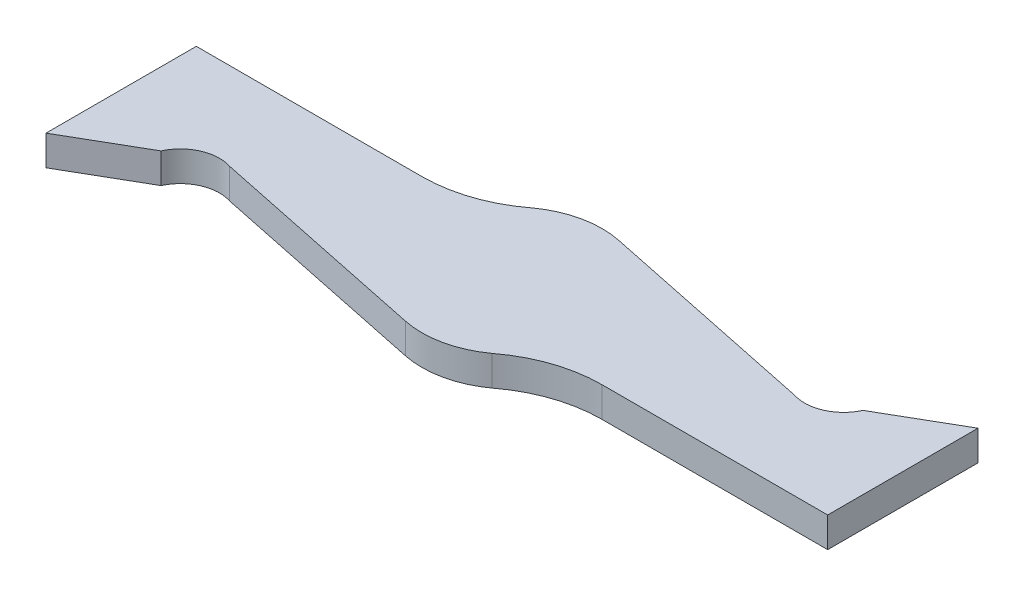
ISO-10303-21;
HEADER;
FILE_DESCRIPTION(('STEP AP214'),'2;1');
FILE_NAME('part.step','',(''),(''),'','','');
FILE_SCHEMA(('AUTOMOTIVE_DESIGN { 1 0 10303 214 1 1 1 1 }'));
ENDSEC;
DATA;
#1=APPLICATION_CONTEXT('core data for automotive mechanical design processes');
#2=APPLICATION_PROTOCOL_DEFINITION('international standard','automotive_design',2000,#1);
#3=PRODUCT_CONTEXT('',#1,'mechanical');
#4=PRODUCT('Part','Part','',(#3));
#5=PRODUCT_RELATED_PRODUCT_CATEGORY('part','',(#4));
#6=PRODUCT_DEFINITION_FORMATION('','',#4);
#7=PRODUCT_DEFINITION_CONTEXT('part definition',#1,'design');
#8=PRODUCT_DEFINITION('design','',#6,#7);
#9=PRODUCT_DEFINITION_SHAPE('','',#8);
#10=(LENGTH_UNIT() NAMED_UNIT(*) SI_UNIT(.MILLI.,.METRE.));
#11=(NAMED_UNIT(*) PLANE_ANGLE_UNIT() SI_UNIT($,.RADIAN.));
#12=(NAMED_UNIT(*) SI_UNIT($,.STERADIAN.) SOLID_ANGLE_UNIT());
#13=UNCERTAINTY_MEASURE_WITH_UNIT(LENGTH_MEASURE(1.E-05),#10,'distance_accuracy_value','');
#14=(GEOMETRIC_REPRESENTATION_CONTEXT(3) GLOBAL_UNCERTAINTY_ASSIGNED_CONTEXT((#13)) GLOBAL_UNIT_ASSIGNED_CONTEXT((#10,
#11,#12)) REPRESENTATION_CONTEXT('',''));
#15=CARTESIAN_POINT('',(0.,0.,0.));
#16=DIRECTION('',(0.,0.,1.));
#17=DIRECTION('',(1.,0.,0.));
#18=AXIS2_PLACEMENT_3D('',#15,#16,#17);
#19=CARTESIAN_POINT('',(-57.15762,12.7,-76.2536321));
#20=DIRECTION('',(0.,-1.,0.));
#21=DIRECTION('',(0.,0.,-1.));
#22=AXIS2_PLACEMENT_3D('',#19,#20,#21);
#23=CYLINDRICAL_SURFACE('',#22,57.2036321);
#24=CARTESIAN_POINT('',(-57.15762,0.,-76.2536321));
#25=DIRECTION('',(0.,1.,0.));
#26=DIRECTION('',(0.,0.,1.));
#27=AXIS2_PLACEMENT_3D('',#24,#25,#26);
#28=CIRCLE('',#27,57.2036321);
#29=CARTESIAN_POINT('',(-57.15762,0.,-19.05));
#30=VERTEX_POINT('',#29);
#31=CARTESIAN_POINT('',(-22.2931447014368,0.,-30.9025142792888));
#32=VERTEX_POINT('',#31);
#33=EDGE_CURVE('E180',#30,#32,#28,.T.);
#34=ORIENTED_EDGE('',*,*,#33,.F.);
#35=DIRECTION('',(0.,-1.,0.));
#36=VECTOR('',#35,1.);
#37=CARTESIAN_POINT('',(-57.15762,12.7,-19.05));
#38=LINE('',#37,#36);
#39=CARTESIAN_POINT('',(-57.15762,12.7,-19.05));
#40=VERTEX_POINT('',#39);
#41=EDGE_CURVE('E11',#40,#30,#38,.T.);
#42=ORIENTED_EDGE('',*,*,#41,.F.);
#43=CARTESIAN_POINT('',(-57.15762,12.7,-76.2536321));
#44=DIRECTION('',(0.,1.,0.));
#45=DIRECTION('',(0.,0.,1.));
#46=AXIS2_PLACEMENT_3D('',#43,#44,#45);
#47=CIRCLE('',#46,57.2036321);
#48=CARTESIAN_POINT('',(-22.2931447014368,12.7,-30.9025142792888));
#49=VERTEX_POINT('',#48);
#50=EDGE_CURVE('E277',#40,#49,#47,.T.);
#51=ORIENTED_EDGE('',*,*,#50,.T.);
#52=DIRECTION('',(0.,-1.,0.));
#53=VECTOR('',#52,1.);
#54=CARTESIAN_POINT('',(-22.2931447014368,12.7,-30.9025142792888));
#55=LINE('',#54,#53);
#56=EDGE_CURVE('E115',#49,#32,#55,.T.);
#57=ORIENTED_EDGE('',*,*,#56,.T.);
#58=EDGE_LOOP('',(#34,#42,#51,#57));
#59=FACE_BOUND('',#58,.T.);
#60=ADVANCED_FACE('F45',(#59),#23,.F.);
#61=CARTESIAN_POINT('',(0.,12.7,-19.05));
#62=DIRECTION('',(0.,0.,-1.));
#63=DIRECTION('',(-1.,0.,0.));
#64=AXIS2_PLACEMENT_3D('',#61,#62,#63);
#65=PLANE('',#64);
#66=DIRECTION('',(1.,0.,0.));
#67=VECTOR('',#66,1.);
#68=CARTESIAN_POINT('',(0.,0.,-19.05));
#69=LINE('',#68,#67);
#70=CARTESIAN_POINT('',(-152.4,0.,-19.05));
#71=VERTEX_POINT('',#70);
#72=EDGE_CURVE('E184',#71,#30,#69,.T.);
#73=ORIENTED_EDGE('',*,*,#72,.F.);
#74=DIRECTION('',(0.,-1.,0.));
#75=VECTOR('',#74,1.);
#76=CARTESIAN_POINT('',(-152.4,12.7,-19.05));
#77=LINE('',#76,#75);
#78=CARTESIAN_POINT('',(-152.4,12.7,-19.05));
#79=VERTEX_POINT('',#78);
#80=EDGE_CURVE('E54',#79,#71,#77,.T.);
#81=ORIENTED_EDGE('',*,*,#80,.F.);
#82=DIRECTION('',(1.,0.,0.));
#83=VECTOR('',#82,1.);
#84=CARTESIAN_POINT('',(0.,12.7,-19.05));
#85=LINE('',#84,#83);
#86=EDGE_CURVE('E273',#79,#40,#85,.T.);
#87=ORIENTED_EDGE('',*,*,#86,.T.);
#88=ORIENTED_EDGE('',*,*,#41,.T.);
#89=EDGE_LOOP('',(#73,#81,#87,#88));
#90=FACE_BOUND('',#89,.T.);
#91=ADVANCED_FACE('F272',(#90),#65,.T.);
#92=CARTESIAN_POINT('',(-152.4,12.7,0.));
#93=DIRECTION('',(1.,0.,0.));
#94=DIRECTION('',(0.,0.,-1.));
#95=AXIS2_PLACEMENT_3D('',#92,#93,#94);
#96=PLANE('',#95);
#97=DIRECTION('',(0.,0.,1.));
#98=VECTOR('',#97,1.);
#99=CARTESIAN_POINT('',(-152.4,0.,0.));
#100=LINE('',#99,#98);
#101=CARTESIAN_POINT('',(-152.4,0.,44.45));
#102=VERTEX_POINT('',#101);
#103=EDGE_CURVE('E188',#71,#102,#100,.T.);
#104=ORIENTED_EDGE('',*,*,#103,.T.);
#105=DIRECTION('',(0.,-1.,0.));
#106=VECTOR('',#105,1.);
#107=CARTESIAN_POINT('',(-152.4,12.7,44.45));
#108=LINE('',#107,#106);
#109=CARTESIAN_POINT('',(-152.4,12.7,44.45));
#110=VERTEX_POINT('',#109);
#111=EDGE_CURVE('E254',#110,#102,#108,.T.);
#112=ORIENTED_EDGE('',*,*,#111,.F.);
#113=DIRECTION('',(0.,0.,1.));
#114=VECTOR('',#113,1.);
#115=CARTESIAN_POINT('',(-152.4,12.7,0.));
#116=LINE('',#115,#114);
#117=EDGE_CURVE('E263',#79,#110,#116,.T.);
#118=ORIENTED_EDGE('',*,*,#117,.F.);
#119=ORIENTED_EDGE('',*,*,#80,.T.);
#120=EDGE_LOOP('',(#104,#112,#118,#119));
#121=FACE_BOUND('',#120,.T.);
#122=ADVANCED_FACE('F261',(#121),#96,.F.);
#123=CARTESIAN_POINT('',(-18.8525854008914,12.7,-32.6536357683748));
#124=DIRECTION('',(-0.500000000000004,0.,-0.866025403784436));
#125=DIRECTION('',(-0.866025403784436,0.,0.500000000000004));
#126=AXIS2_PLACEMENT_3D('',#123,#124,#125);
#127=PLANE('',#126);
#128=DIRECTION('',(0.866025403784436,0.,-0.500000000000004));
#129=VECTOR('',#128,1.);
#130=CARTESIAN_POINT('',(-18.8525854008914,0.,-32.6536357683748));
#131=LINE('',#130,#129);
#132=CARTESIAN_POINT('',(-121.604136641425,0.,26.6699999999999));
#133=VERTEX_POINT('',#132);
#134=EDGE_CURVE('E191',#102,#133,#131,.T.);
#135=ORIENTED_EDGE('',*,*,#134,.T.);
#136=DIRECTION('',(0.,-1.,0.));
#137=VECTOR('',#136,1.);
#138=CARTESIAN_POINT('',(-121.604136641425,12.7,26.6699999999999));
#139=LINE('',#138,#137);
#140=CARTESIAN_POINT('',(-121.604136641425,12.7,26.6699999999999));
#141=VERTEX_POINT('',#140);
#142=EDGE_CURVE('E250',#141,#133,#139,.T.);
#143=ORIENTED_EDGE('',*,*,#142,.F.);
#144=DIRECTION('',(0.866025403784436,0.,-0.500000000000004));
#145=VECTOR('',#144,1.);
#146=CARTESIAN_POINT('',(-18.8525854008914,12.7,-32.6536357683748));
#147=LINE('',#146,#145);
#148=EDGE_CURVE('E285',#110,#141,#147,.T.);
#149=ORIENTED_EDGE('',*,*,#148,.F.);
#150=ORIENTED_EDGE('',*,*,#111,.T.);
#151=EDGE_LOOP('',(#135,#143,#149,#150));
#152=FACE_BOUND('',#151,.T.);
#153=ADVANCED_FACE('F334',(#152),#127,.F.);
#154=CARTESIAN_POINT('',(-106.581784168917,12.7,33.5190164397327));
#155=DIRECTION('',(0.,-1.,0.));
#156=DIRECTION('',(0.,0.,-1.));
#157=AXIS2_PLACEMENT_3D('',#154,#155,#156);
#158=CYLINDRICAL_SURFACE('',#157,16.51);
#159=CARTESIAN_POINT('',(-106.581784168917,0.,33.5190164397327));
#160=DIRECTION('',(0.,1.,0.));
#161=DIRECTION('',(0.,0.,1.));
#162=AXIS2_PLACEMENT_3D('',#159,#160,#161);
#163=CIRCLE('',#162,16.51);
#164=CARTESIAN_POINT('',(-101.565513761579,0.,17.7895176810164));
#165=VERTEX_POINT('',#164);
#166=EDGE_CURVE('E194',#133,#165,#163,.F.);
#167=ORIENTED_EDGE('',*,*,#166,.T.);
#168=DIRECTION('',(0.,-1.,0.));
#169=VECTOR('',#168,1.);
#170=CARTESIAN_POINT('',(-101.565513761579,12.7,17.7895176810164));
#171=LINE('',#170,#169);
#172=CARTESIAN_POINT('',(-101.565513761579,12.7,17.7895176810164));
#173=VERTEX_POINT('',#172);
#174=EDGE_CURVE('E246',#173,#165,#171,.T.);
#175=ORIENTED_EDGE('',*,*,#174,.F.);
#176=CARTESIAN_POINT('',(-106.581784168917,12.7,33.5190164397327));
#177=DIRECTION('',(0.,1.,0.));
#178=DIRECTION('',(0.,0.,1.));
#179=AXIS2_PLACEMENT_3D('',#176,#177,#178);
#180=CIRCLE('',#179,16.51);
#181=EDGE_CURVE('E288',#141,#173,#180,.F.);
#182=ORIENTED_EDGE('',*,*,#181,.F.);
#183=ORIENTED_EDGE('',*,*,#142,.T.);
#184=EDGE_LOOP('',(#167,#175,#182,#183));
#185=FACE_BOUND('',#184,.T.);
#186=ADVANCED_FACE('F339',(#185),#158,.F.);
#187=CARTESIAN_POINT('',(-7.75977768772742,12.7,37.3030039921806));
#188=DIRECTION('',(0.203660410202094,0.,-0.979041591208624));
#189=DIRECTION('',(-0.979041591208624,0.,-0.203660410202094));
#190=AXIS2_PLACEMENT_3D('',#187,#188,#189);
#191=PLANE('',#190);
#192=DIRECTION('',(0.979041591208624,0.,0.203660410202094));
#193=VECTOR('',#192,1.);
#194=CARTESIAN_POINT('',(-7.75977768772742,0.,37.3030039921806));
#195=LINE('',#194,#193);
#196=CARTESIAN_POINT('',(-7.76708162869975,0.,37.3014846250486));
#197=VERTEX_POINT('',#196);
#198=EDGE_CURVE('E197',#165,#197,#195,.T.);
#199=ORIENTED_EDGE('',*,*,#198,.T.);
#200=DIRECTION('',(0.,-1.,0.));
#201=VECTOR('',#200,1.);
#202=CARTESIAN_POINT('',(-7.76708162869975,12.7,37.3014846250486));
#203=LINE('',#202,#201);
#204=CARTESIAN_POINT('',(-7.76708162869975,12.7,37.3014846250486));
#205=VERTEX_POINT('',#204);
#206=EDGE_CURVE('E242',#205,#197,#203,.T.);
#207=ORIENTED_EDGE('',*,*,#206,.F.);
#208=DIRECTION('',(0.979041591208624,0.,0.203660410202094));
#209=VECTOR('',#208,1.);
#210=CARTESIAN_POINT('',(-7.75977768772742,12.7,37.3030039921806));
#211=LINE('',#210,#209);
#212=EDGE_CURVE('E291',#173,#205,#211,.T.);
#213=ORIENTED_EDGE('',*,*,#212,.F.);
#214=ORIENTED_EDGE('',*,*,#174,.T.);
#215=EDGE_LOOP('',(#199,#207,#213,#214));
#216=FACE_BOUND('',#215,.T.);
#217=ADVANCED_FACE('F343',(#216),#191,.F.);
#218=CARTESIAN_POINT('',(-0.00761999999999985,12.7,0.));
#219=DIRECTION('',(0.,-1.,0.));
#220=DIRECTION('',(0.,0.,-1.));
#221=AXIS2_PLACEMENT_3D('',#218,#219,#220);
#222=CYLINDRICAL_SURFACE('',#221,38.1);
#223=CARTESIAN_POINT('',(-0.00761999999999985,0.,0.));
#224=DIRECTION('',(0.,1.,0.));
#225=DIRECTION('',(0.,0.,1.));
#226=AXIS2_PLACEMENT_3D('',#223,#224,#225);
#227=CIRCLE('',#226,38.1);
#228=CARTESIAN_POINT('',(22.4174253605217,0.,30.8014178339008));
#229=VERTEX_POINT('',#228);
#230=EDGE_CURVE('E200',#197,#229,#227,.T.);
#231=ORIENTED_EDGE('',*,*,#230,.T.);
#232=DIRECTION('',(0.,-1.,0.));
#233=VECTOR('',#232,1.);
#234=CARTESIAN_POINT('',(22.4174253605217,12.7,30.8014178339008));
#235=LINE('',#234,#233);
#236=CARTESIAN_POINT('',(22.4174253605217,12.7,30.8014178339008));
#237=VERTEX_POINT('',#236);
#238=EDGE_CURVE('E239',#237,#229,#235,.T.);
#239=ORIENTED_EDGE('',*,*,#238,.F.);
#240=CARTESIAN_POINT('',(-0.00761999999999985,12.7,0.));
#241=DIRECTION('',(0.,1.,0.));
#242=DIRECTION('',(0.,0.,1.));
#243=AXIS2_PLACEMENT_3D('',#240,#241,#242);
#244=CIRCLE('',#243,38.1);
#245=EDGE_CURVE('E177',#205,#237,#244,.T.);
#246=ORIENTED_EDGE('',*,*,#245,.F.);
#247=ORIENTED_EDGE('',*,*,#206,.T.);
#248=EDGE_LOOP('',(#231,#239,#246,#247));
#249=FACE_BOUND('',#248,.T.);
#250=ADVANCED_FACE('F347',(#249),#222,.T.);
#251=CARTESIAN_POINT('',(57.15,12.7,76.2536319870848));
#252=DIRECTION('',(0.,-1.,0.));
#253=DIRECTION('',(0.,0.,-1.));
#254=AXIS2_PLACEMENT_3D('',#251,#252,#253);
#255=CYLINDRICAL_SURFACE('',#254,57.2036319870848);
#256=CARTESIAN_POINT('',(57.15,0.,76.2536319870848));
#257=DIRECTION('',(0.,1.,0.));
#258=DIRECTION('',(0.,0.,1.));
#259=AXIS2_PLACEMENT_3D('',#256,#257,#258);
#260=CIRCLE('',#259,57.2036319870848);
#261=CARTESIAN_POINT('',(57.1500000000001,0.,19.05));
#262=VERTEX_POINT('',#261);
#263=EDGE_CURVE('E204',#262,#229,#260,.T.);
#264=ORIENTED_EDGE('',*,*,#263,.F.);
#265=DIRECTION('',(0.,-1.,0.));
#266=VECTOR('',#265,1.);
#267=CARTESIAN_POINT('',(57.1500000000001,12.7,19.05));
#268=LINE('',#267,#266);
#269=CARTESIAN_POINT('',(57.1500000000001,12.7,19.05));
#270=VERTEX_POINT('',#269);
#271=EDGE_CURVE('E236',#270,#262,#268,.T.);
#272=ORIENTED_EDGE('',*,*,#271,.F.);
#273=CARTESIAN_POINT('',(57.15,12.7,76.2536319870848));
#274=DIRECTION('',(0.,1.,0.));
#275=DIRECTION('',(0.,0.,1.));
#276=AXIS2_PLACEMENT_3D('',#273,#274,#275);
#277=CIRCLE('',#276,57.2036319870848);
#278=EDGE_CURVE('E295',#270,#237,#277,.T.);
#279=ORIENTED_EDGE('',*,*,#278,.T.);
#280=ORIENTED_EDGE('',*,*,#238,.T.);
#281=EDGE_LOOP('',(#264,#272,#279,#280));
#282=FACE_BOUND('',#281,.T.);
#283=ADVANCED_FACE('F349',(#282),#255,.F.);
#284=CARTESIAN_POINT('',(0.,12.7,19.05));
#285=DIRECTION('',(0.,0.,1.));
#286=DIRECTION('',(1.,0.,0.));
#287=AXIS2_PLACEMENT_3D('',#284,#285,#286);
#288=PLANE('',#287);
#289=DIRECTION('',(-1.,0.,0.));
#290=VECTOR('',#289,1.);
#291=CARTESIAN_POINT('',(0.,0.,19.05));
#292=LINE('',#291,#290);
#293=CARTESIAN_POINT('',(152.4,0.,19.05));
#294=VERTEX_POINT('',#293);
#295=EDGE_CURVE('E209',#294,#262,#292,.T.);
#296=ORIENTED_EDGE('',*,*,#295,.F.);
#297=DIRECTION('',(0.,-1.,0.));
#298=VECTOR('',#297,1.);
#299=CARTESIAN_POINT('',(152.4,12.7,19.05));
#300=LINE('',#299,#298);
#301=CARTESIAN_POINT('',(152.4,12.7,19.05));
#302=VERTEX_POINT('',#301);
#303=EDGE_CURVE('E233',#302,#294,#300,.T.);
#304=ORIENTED_EDGE('',*,*,#303,.F.);
#305=DIRECTION('',(-1.,0.,0.));
#306=VECTOR('',#305,1.);
#307=CARTESIAN_POINT('',(0.,12.7,19.05));
#308=LINE('',#307,#306);
#309=EDGE_CURVE('E299',#302,#270,#308,.T.);
#310=ORIENTED_EDGE('',*,*,#309,.T.);
#311=ORIENTED_EDGE('',*,*,#271,.T.);
#312=EDGE_LOOP('',(#296,#304,#310,#311));
#313=FACE_BOUND('',#312,.T.);
#314=ADVANCED_FACE('F314',(#313),#288,.T.);
#315=CARTESIAN_POINT('',(152.4,12.7,0.));
#316=DIRECTION('',(1.,0.,0.));
#317=DIRECTION('',(0.,0.,-1.));
#318=AXIS2_PLACEMENT_3D('',#315,#316,#317);
#319=PLANE('',#318);
#320=DIRECTION('',(0.,0.,1.));
#321=VECTOR('',#320,1.);
#322=CARTESIAN_POINT('',(152.4,0.,0.));
#323=LINE('',#322,#321);
#324=CARTESIAN_POINT('',(152.4,0.,-44.45));
#325=VERTEX_POINT('',#324);
#326=EDGE_CURVE('E213',#325,#294,#323,.T.);
#327=ORIENTED_EDGE('',*,*,#326,.F.);
#328=DIRECTION('',(0.,-1.,0.));
#329=VECTOR('',#328,1.);
#330=CARTESIAN_POINT('',(152.4,12.7,-44.45));
#331=LINE('',#330,#329);
#332=CARTESIAN_POINT('',(152.4,12.7,-44.45));
#333=VERTEX_POINT('',#332);
#334=EDGE_CURVE('E230',#333,#325,#331,.T.);
#335=ORIENTED_EDGE('',*,*,#334,.F.);
#336=DIRECTION('',(0.,0.,1.));
#337=VECTOR('',#336,1.);
#338=CARTESIAN_POINT('',(152.4,12.7,0.));
#339=LINE('',#338,#337);
#340=EDGE_CURVE('E303',#333,#302,#339,.T.);
#341=ORIENTED_EDGE('',*,*,#340,.T.);
#342=ORIENTED_EDGE('',*,*,#303,.T.);
#343=EDGE_LOOP('',(#327,#335,#341,#342));
#344=FACE_BOUND('',#343,.T.);
#345=ADVANCED_FACE('F309',(#344),#319,.T.);
#346=CARTESIAN_POINT('',(18.8525854008906,12.7,32.653635768374));
#347=DIRECTION('',(0.499999999999998,0.,0.86602540378444));
#348=DIRECTION('',(0.86602540378444,0.,-0.499999999999998));
#349=AXIS2_PLACEMENT_3D('',#346,#347,#348);
#350=PLANE('',#349);
#351=DIRECTION('',(-0.86602540378444,0.,0.499999999999998));
#352=VECTOR('',#351,1.);
#353=CARTESIAN_POINT('',(18.8525854008906,0.,32.653635768374));
#354=LINE('',#353,#352);
#355=CARTESIAN_POINT('',(121.604136641425,0.,-26.6700000000001));
#356=VERTEX_POINT('',#355);
#357=EDGE_CURVE('E217',#325,#356,#354,.T.);
#358=ORIENTED_EDGE('',*,*,#357,.T.);
#359=DIRECTION('',(0.,-1.,0.));
#360=VECTOR('',#359,1.);
#361=CARTESIAN_POINT('',(121.604136641425,12.7,-26.6700000000001));
#362=LINE('',#361,#360);
#363=CARTESIAN_POINT('',(121.604136641425,12.7,-26.6700000000001));
#364=VERTEX_POINT('',#363);
#365=EDGE_CURVE('E169',#364,#356,#362,.T.);
#366=ORIENTED_EDGE('',*,*,#365,.F.);
#367=DIRECTION('',(-0.86602540378444,0.,0.499999999999998));
#368=VECTOR('',#367,1.);
#369=CARTESIAN_POINT('',(18.8525854008906,12.7,32.653635768374));
#370=LINE('',#369,#368);
#371=EDGE_CURVE('E158',#333,#364,#370,.T.);
#372=ORIENTED_EDGE('',*,*,#371,.F.);
#373=ORIENTED_EDGE('',*,*,#334,.T.);
#374=EDGE_LOOP('',(#358,#366,#372,#373));
#375=FACE_BOUND('',#374,.T.);
#376=ADVANCED_FACE('F318',(#375),#350,.F.);
#377=CARTESIAN_POINT('',(106.581784095362,12.7,-33.5190162783996));
#378=DIRECTION('',(0.,-1.,0.));
#379=DIRECTION('',(0.,0.,-1.));
#380=AXIS2_PLACEMENT_3D('',#377,#378,#379);
#381=CYLINDRICAL_SURFACE('',#380,16.51);
#382=CARTESIAN_POINT('',(106.581784095362,0.,-33.5190162783996));
#383=DIRECTION('',(0.,1.,0.));
#384=DIRECTION('',(0.,0.,1.));
#385=AXIS2_PLACEMENT_3D('',#382,#383,#384);
#386=CIRCLE('',#385,16.51);
#387=CARTESIAN_POINT('',(101.565513803784,0.,-17.7895174827662));
#388=VERTEX_POINT('',#387);
#389=EDGE_CURVE('E167',#356,#388,#386,.F.);
#390=ORIENTED_EDGE('',*,*,#389,.T.);
#391=DIRECTION('',(0.,-1.,0.));
#392=VECTOR('',#391,1.);
#393=CARTESIAN_POINT('',(101.565513803784,12.7,-17.7895174827662));
#394=LINE('',#393,#392);
#395=CARTESIAN_POINT('',(101.565513803784,12.7,-17.7895174827662));
#396=VERTEX_POINT('',#395);
#397=EDGE_CURVE('E164',#396,#388,#394,.T.);
#398=ORIENTED_EDGE('',*,*,#397,.F.);
#399=CARTESIAN_POINT('',(106.581784095362,12.7,-33.5190162783996));
#400=DIRECTION('',(0.,1.,0.));
#401=DIRECTION('',(0.,0.,1.));
#402=AXIS2_PLACEMENT_3D('',#399,#400,#401);
#403=CIRCLE('',#402,16.51);
#404=EDGE_CURVE('E151',#364,#396,#403,.F.);
#405=ORIENTED_EDGE('',*,*,#404,.F.);
#406=ORIENTED_EDGE('',*,*,#365,.T.);
#407=EDGE_LOOP('',(#390,#398,#405,#406));
#408=FACE_BOUND('',#407,.T.);
#409=ADVANCED_FACE('F165',(#408),#381,.F.);
#410=CARTESIAN_POINT('',(7.75793749727359,12.7,-37.3002167877523));
#411=DIRECTION('',(-0.203628699682054,0.,0.979048187101021));
#412=DIRECTION('',(0.979048187101021,0.,0.203628699682054));
#413=AXIS2_PLACEMENT_3D('',#410,#411,#412);
#414=PLANE('',#413);
#415=DIRECTION('',(-0.979048187101021,0.,-0.203628699682054));
#416=VECTOR('',#415,1.);
#417=CARTESIAN_POINT('',(7.75793749727359,0.,-37.3002167877523));
#418=LINE('',#417,#416);
#419=CARTESIAN_POINT('',(7.7506334578867,0.,-37.3017359285488));
#420=VERTEX_POINT('',#419);
#421=EDGE_CURVE('E108',#388,#420,#418,.T.);
#422=ORIENTED_EDGE('',*,*,#421,.T.);
#423=DIRECTION('',(0.,-1.,0.));
#424=VECTOR('',#423,1.);
#425=CARTESIAN_POINT('',(7.7506334578867,12.7,-37.3017359285488));
#426=LINE('',#425,#424);
#427=CARTESIAN_POINT('',(7.7506334578867,12.7,-37.3017359285488));
#428=VERTEX_POINT('',#427);
#429=EDGE_CURVE('E170',#428,#420,#426,.T.);
#430=ORIENTED_EDGE('',*,*,#429,.F.);
#431=DIRECTION('',(-0.979048187101021,0.,-0.203628699682054));
#432=VECTOR('',#431,1.);
#433=CARTESIAN_POINT('',(7.75793749727359,12.7,-37.3002167877523));
#434=LINE('',#433,#432);
#435=EDGE_CURVE('E155',#396,#428,#434,.T.);
#436=ORIENTED_EDGE('',*,*,#435,.F.);
#437=ORIENTED_EDGE('',*,*,#397,.T.);
#438=EDGE_LOOP('',(#422,#430,#436,#437));
#439=FACE_BOUND('',#438,.T.);
#440=ADVANCED_FACE('F172',(#439),#414,.F.);
#441=EDGE_CURVE('E205',#420,#32,#227,.T.);
#442=ORIENTED_EDGE('',*,*,#441,.T.);
#443=ORIENTED_EDGE('',*,*,#56,.F.);
#444=EDGE_CURVE('E62',#428,#49,#244,.T.);
#445=ORIENTED_EDGE('',*,*,#444,.F.);
#446=ORIENTED_EDGE('',*,*,#429,.T.);
#447=EDGE_LOOP('',(#442,#443,#445,#446));
#448=FACE_BOUND('',#447,.T.);
#449=ADVANCED_FACE('F385',(#448),#222,.T.);
#450=CARTESIAN_POINT('',(0.,12.7,0.));
#451=DIRECTION('',(0.,1.,0.));
#452=DIRECTION('',(0.,0.,1.));
#453=AXIS2_PLACEMENT_3D('',#450,#451,#452);
#454=PLANE('',#453);
#455=ORIENTED_EDGE('',*,*,#50,.F.);
#456=ORIENTED_EDGE('',*,*,#86,.F.);
#457=ORIENTED_EDGE('',*,*,#117,.T.);
#458=ORIENTED_EDGE('',*,*,#148,.T.);
#459=ORIENTED_EDGE('',*,*,#181,.T.);
#460=ORIENTED_EDGE('',*,*,#212,.T.);
#461=ORIENTED_EDGE('',*,*,#245,.T.);
#462=ORIENTED_EDGE('',*,*,#278,.F.);
#463=ORIENTED_EDGE('',*,*,#309,.F.);
#464=ORIENTED_EDGE('',*,*,#340,.F.);
#465=ORIENTED_EDGE('',*,*,#371,.T.);
#466=ORIENTED_EDGE('',*,*,#404,.T.);
#467=ORIENTED_EDGE('',*,*,#435,.T.);
#468=ORIENTED_EDGE('',*,*,#444,.T.);
#469=EDGE_LOOP('',(#455,#456,#457,#458,#459,#460,#461,#462,#463,#464,#465,#466,#467,#468));
#470=FACE_BOUND('',#469,.T.);
#471=ADVANCED_FACE('F153',(#470),#454,.T.);
#472=CARTESIAN_POINT('',(0.,0.,0.));
#473=DIRECTION('',(0.,1.,0.));
#474=DIRECTION('',(0.,0.,1.));
#475=AXIS2_PLACEMENT_3D('',#472,#473,#474);
#476=PLANE('',#475);
#477=ORIENTED_EDGE('',*,*,#33,.T.);
#478=ORIENTED_EDGE('',*,*,#441,.F.);
#479=ORIENTED_EDGE('',*,*,#421,.F.);
#480=ORIENTED_EDGE('',*,*,#389,.F.);
#481=ORIENTED_EDGE('',*,*,#357,.F.);
#482=ORIENTED_EDGE('',*,*,#326,.T.);
#483=ORIENTED_EDGE('',*,*,#295,.T.);
#484=ORIENTED_EDGE('',*,*,#263,.T.);
#485=ORIENTED_EDGE('',*,*,#230,.F.);
#486=ORIENTED_EDGE('',*,*,#198,.F.);
#487=ORIENTED_EDGE('',*,*,#166,.F.);
#488=ORIENTED_EDGE('',*,*,#134,.F.);
#489=ORIENTED_EDGE('',*,*,#103,.F.);
#490=ORIENTED_EDGE('',*,*,#72,.T.);
#491=EDGE_LOOP('',(#477,#478,#479,#480,#481,#482,#483,#484,#485,#486,#487,#488,#489,#490));
#492=FACE_BOUND('',#491,.T.);
#493=ADVANCED_FACE('F270',(#492),#476,.F.);
#494=CLOSED_SHELL('',(#60,#91,#122,#153,#186,#217,#250,#283,#314,#345,#376,#409,#440,#449,#471,#493));
#495=MANIFOLD_SOLID_BREP('B2',#494);
#496=ADVANCED_BREP_SHAPE_REPRESENTATION('',(#18,#495),#14);
#497=SHAPE_DEFINITION_REPRESENTATION(#9,#496);
ENDSEC;
END-ISO-10303-21;
